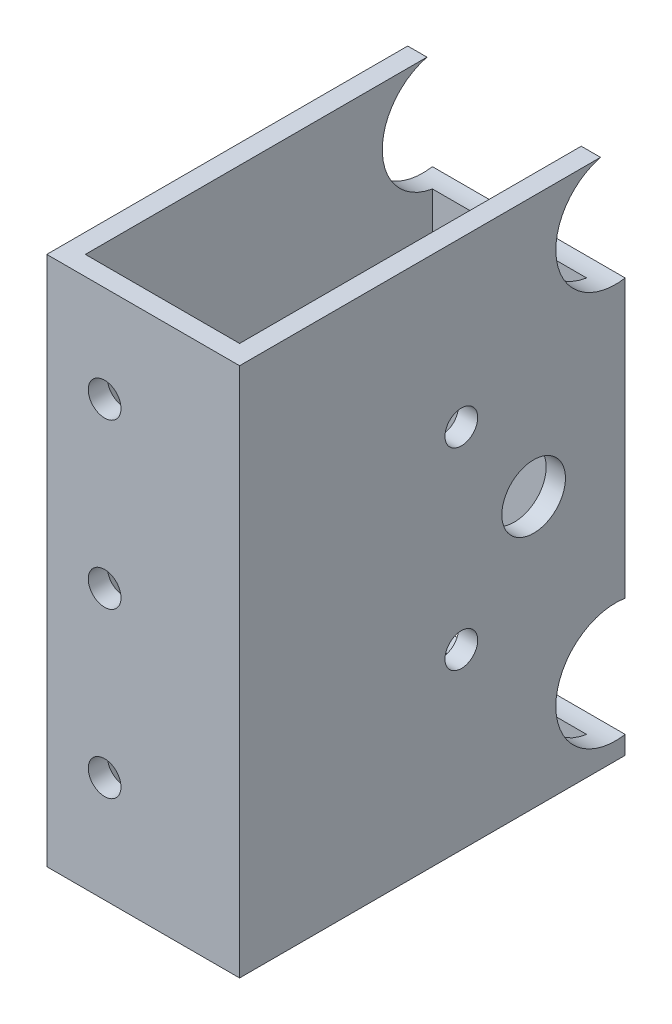
ISO-10303-21;
HEADER;
FILE_DESCRIPTION(('STEP AP214'),'2;1');
FILE_NAME('part.step','',(''),(''),'','','');
FILE_SCHEMA(('AUTOMOTIVE_DESIGN { 1 0 10303 214 1 1 1 1 }'));
ENDSEC;
DATA;
#1=APPLICATION_CONTEXT('core data for automotive mechanical design processes');
#2=APPLICATION_PROTOCOL_DEFINITION('international standard','automotive_design',2000,#1);
#3=PRODUCT_CONTEXT('',#1,'mechanical');
#4=PRODUCT('Part','Part','',(#3));
#5=PRODUCT_RELATED_PRODUCT_CATEGORY('part','',(#4));
#6=PRODUCT_DEFINITION_FORMATION('','',#4);
#7=PRODUCT_DEFINITION_CONTEXT('part definition',#1,'design');
#8=PRODUCT_DEFINITION('design','',#6,#7);
#9=PRODUCT_DEFINITION_SHAPE('','',#8);
#10=(LENGTH_UNIT() NAMED_UNIT(*) SI_UNIT(.MILLI.,.METRE.));
#11=(NAMED_UNIT(*) PLANE_ANGLE_UNIT() SI_UNIT($,.RADIAN.));
#12=(NAMED_UNIT(*) SI_UNIT($,.STERADIAN.) SOLID_ANGLE_UNIT());
#13=UNCERTAINTY_MEASURE_WITH_UNIT(LENGTH_MEASURE(1.E-05),#10,'distance_accuracy_value','');
#14=(GEOMETRIC_REPRESENTATION_CONTEXT(3) GLOBAL_UNCERTAINTY_ASSIGNED_CONTEXT((#13)) GLOBAL_UNIT_ASSIGNED_CONTEXT((#10,
#11,#12)) REPRESENTATION_CONTEXT('',''));
#15=CARTESIAN_POINT('',(0.,0.,0.));
#16=DIRECTION('',(0.,0.,1.));
#17=DIRECTION('',(1.,0.,0.));
#18=AXIS2_PLACEMENT_3D('',#15,#16,#17);
#19=CARTESIAN_POINT('',(0.,0.,-29.));
#20=DIRECTION('',(0.,0.,1.));
#21=DIRECTION('',(1.,0.,0.));
#22=AXIS2_PLACEMENT_3D('',#19,#20,#21);
#23=PLANE('',#22);
#24=DIRECTION('',(-1.,0.,0.));
#25=VECTOR('',#24,1.);
#26=CARTESIAN_POINT('',(49.9,43.8811765836887,-29.));
#27=LINE('',#26,#25);
#28=CARTESIAN_POINT('',(29.708348754,43.8811765836887,-29.));
#29=VERTEX_POINT('',#28);
#30=CARTESIAN_POINT('',(49.708348754,43.8811765836887,-29.));
#31=VERTEX_POINT('',#30);
#32=EDGE_CURVE('E279',#29,#31,#27,.F.);
#33=ORIENTED_EDGE('',*,*,#32,.T.);
#34=DIRECTION('',(0.,-1.,0.));
#35=VECTOR('',#34,1.);
#36=CARTESIAN_POINT('',(49.708348754,56.,-29.));
#37=LINE('',#36,#35);
#38=CARTESIAN_POINT('',(49.708348754,15.1188234163113,-29.));
#39=VERTEX_POINT('',#38);
#40=EDGE_CURVE('E198',#31,#39,#37,.T.);
#41=ORIENTED_EDGE('',*,*,#40,.T.);
#42=DIRECTION('',(-1.,0.,0.));
#43=VECTOR('',#42,1.);
#44=CARTESIAN_POINT('',(49.9,15.1188234163113,-29.));
#45=LINE('',#44,#43);
#46=CARTESIAN_POINT('',(29.708348754,15.1188234163113,-29.));
#47=VERTEX_POINT('',#46);
#48=EDGE_CURVE('E283',#39,#47,#45,.T.);
#49=ORIENTED_EDGE('',*,*,#48,.T.);
#50=DIRECTION('',(0.,1.,0.));
#51=VECTOR('',#50,1.);
#52=CARTESIAN_POINT('',(29.708348754,1.,-29.));
#53=LINE('',#52,#51);
#54=EDGE_CURVE('E181',#47,#29,#53,.T.);
#55=ORIENTED_EDGE('',*,*,#54,.T.);
#56=EDGE_LOOP('',(#33,#41,#49,#55));
#57=FACE_BOUND('',#56,.T.);
#58=ADVANCED_FACE('F41',(#57),#23,.F.);
#59=CARTESIAN_POINT('',(0.,0.,-27.));
#60=DIRECTION('',(0.,0.,1.));
#61=DIRECTION('',(1.,0.,0.));
#62=AXIS2_PLACEMENT_3D('',#59,#60,#61);
#63=PLANE('',#62);
#64=DIRECTION('',(0.,1.,0.));
#65=VECTOR('',#64,1.);
#66=CARTESIAN_POINT('',(31.708348754,0.899999999999999,-27.));
#67=LINE('',#66,#65);
#68=CARTESIAN_POINT('',(31.708348754,15.1188234163113,-27.));
#69=VERTEX_POINT('',#68);
#70=CARTESIAN_POINT('',(31.708348754,43.8811765836887,-27.));
#71=VERTEX_POINT('',#70);
#72=EDGE_CURVE('E293',#69,#71,#67,.T.);
#73=ORIENTED_EDGE('',*,*,#72,.F.);
#74=DIRECTION('',(-1.,0.,0.));
#75=VECTOR('',#74,1.);
#76=CARTESIAN_POINT('',(49.9,15.1188234163113,-27.));
#77=LINE('',#76,#75);
#78=CARTESIAN_POINT('',(47.708348754,15.1188234163113,-27.));
#79=VERTEX_POINT('',#78);
#80=EDGE_CURVE('E161',#79,#69,#77,.T.);
#81=ORIENTED_EDGE('',*,*,#80,.F.);
#82=DIRECTION('',(0.,-1.,0.));
#83=VECTOR('',#82,1.);
#84=CARTESIAN_POINT('',(47.708348754,56.1,-27.));
#85=LINE('',#84,#83);
#86=CARTESIAN_POINT('',(47.708348754,43.8811765836887,-27.));
#87=VERTEX_POINT('',#86);
#88=EDGE_CURVE('E143',#87,#79,#85,.T.);
#89=ORIENTED_EDGE('',*,*,#88,.F.);
#90=DIRECTION('',(-1.,0.,0.));
#91=VECTOR('',#90,1.);
#92=CARTESIAN_POINT('',(49.9,43.8811765836887,-27.));
#93=LINE('',#92,#91);
#94=EDGE_CURVE('E151',#71,#87,#93,.F.);
#95=ORIENTED_EDGE('',*,*,#94,.F.);
#96=EDGE_LOOP('',(#73,#81,#89,#95));
#97=FACE_BOUND('',#96,.T.);
#98=ADVANCED_FACE('F163',(#97),#63,.T.);
#99=CARTESIAN_POINT('',(29.708348754,56.,11.));
#100=DIRECTION('',(0.,-1.,0.));
#101=DIRECTION('',(0.,0.,1.));
#102=AXIS2_PLACEMENT_3D('',#99,#100,#101);
#103=PLANE('',#102);
#104=DIRECTION('',(-1.,0.,0.));
#105=VECTOR('',#104,1.);
#106=CARTESIAN_POINT('',(49.9,56.,-26.4379500648187));
#107=LINE('',#106,#105);
#108=CARTESIAN_POINT('',(49.708348754,56.,-26.4379500648187));
#109=VERTEX_POINT('',#108);
#110=CARTESIAN_POINT('',(47.708348754,56.,-26.4379500648187));
#111=VERTEX_POINT('',#110);
#112=EDGE_CURVE('E156',#109,#111,#107,.T.);
#113=ORIENTED_EDGE('',*,*,#112,.T.);
#114=DIRECTION('',(0.,0.,1.));
#115=VECTOR('',#114,1.);
#116=CARTESIAN_POINT('',(47.708348754,56.,11.));
#117=LINE('',#116,#115);
#118=CARTESIAN_POINT('',(47.708348754,56.,9.00000000000001));
#119=VERTEX_POINT('',#118);
#120=EDGE_CURVE('E150',#111,#119,#117,.T.);
#121=ORIENTED_EDGE('',*,*,#120,.T.);
#122=DIRECTION('',(1.,0.,0.));
#123=VECTOR('',#122,1.);
#124=CARTESIAN_POINT('',(29.708348754,56.,9.00000000000001));
#125=LINE('',#124,#123);
#126=CARTESIAN_POINT('',(31.708348754,56.,9.00000000000001));
#127=VERTEX_POINT('',#126);
#128=EDGE_CURVE('E172',#127,#119,#125,.T.);
#129=ORIENTED_EDGE('',*,*,#128,.F.);
#130=DIRECTION('',(0.,0.,-1.));
#131=VECTOR('',#130,1.);
#132=CARTESIAN_POINT('',(31.708348754,56.,11.));
#133=LINE('',#132,#131);
#134=CARTESIAN_POINT('',(31.708348754,56.,-26.4379500648187));
#135=VERTEX_POINT('',#134);
#136=EDGE_CURVE('E178',#127,#135,#133,.T.);
#137=ORIENTED_EDGE('',*,*,#136,.T.);
#138=CARTESIAN_POINT('',(29.708348754,56.,-26.4379500648187));
#139=VERTEX_POINT('',#138);
#140=EDGE_CURVE('E266',#135,#139,#107,.T.);
#141=ORIENTED_EDGE('',*,*,#140,.T.);
#142=DIRECTION('',(0.,0.,-1.));
#143=VECTOR('',#142,1.);
#144=CARTESIAN_POINT('',(29.708348754,56.,11.));
#145=LINE('',#144,#143);
#146=CARTESIAN_POINT('',(29.708348754,56.,11.));
#147=VERTEX_POINT('',#146);
#148=EDGE_CURVE('E209',#147,#139,#145,.T.);
#149=ORIENTED_EDGE('',*,*,#148,.F.);
#150=DIRECTION('',(1.,0.,0.));
#151=VECTOR('',#150,1.);
#152=CARTESIAN_POINT('',(29.708348754,56.,11.));
#153=LINE('',#152,#151);
#154=CARTESIAN_POINT('',(49.708348754,56.,11.));
#155=VERTEX_POINT('',#154);
#156=EDGE_CURVE('E183',#147,#155,#153,.T.);
#157=ORIENTED_EDGE('',*,*,#156,.T.);
#158=DIRECTION('',(0.,0.,-1.));
#159=VECTOR('',#158,1.);
#160=CARTESIAN_POINT('',(49.708348754,56.,11.));
#161=LINE('',#160,#159);
#162=EDGE_CURVE('E207',#155,#109,#161,.T.);
#163=ORIENTED_EDGE('',*,*,#162,.T.);
#164=EDGE_LOOP('',(#113,#121,#129,#137,#141,#149,#157,#163));
#165=FACE_BOUND('',#164,.T.);
#166=ADVANCED_FACE('F327',(#165),#103,.F.);
#167=DIRECTION('',(-1.,0.,0.));
#168=VECTOR('',#167,1.);
#169=CARTESIAN_POINT('',(49.9,2.88117658368866,-29.));
#170=LINE('',#169,#168);
#171=CARTESIAN_POINT('',(29.708348754,2.88117658368866,-29.));
#172=VERTEX_POINT('',#171);
#173=CARTESIAN_POINT('',(49.708348754,2.88117658368866,-29.));
#174=VERTEX_POINT('',#173);
#175=EDGE_CURVE('E286',#172,#174,#170,.F.);
#176=ORIENTED_EDGE('',*,*,#175,.T.);
#177=CARTESIAN_POINT('',(49.708348754,1.,-29.));
#178=VERTEX_POINT('',#177);
#179=EDGE_CURVE('E200',#174,#178,#37,.T.);
#180=ORIENTED_EDGE('',*,*,#179,.T.);
#181=DIRECTION('',(-1.,0.,0.));
#182=VECTOR('',#181,1.);
#183=CARTESIAN_POINT('',(49.708348754,1.,-29.));
#184=LINE('',#183,#182);
#185=CARTESIAN_POINT('',(29.708348754,1.,-29.));
#186=VERTEX_POINT('',#185);
#187=EDGE_CURVE('E184',#178,#186,#184,.T.);
#188=ORIENTED_EDGE('',*,*,#187,.T.);
#189=EDGE_CURVE('E193',#186,#172,#53,.T.);
#190=ORIENTED_EDGE('',*,*,#189,.T.);
#191=EDGE_LOOP('',(#176,#180,#188,#190));
#192=FACE_BOUND('',#191,.T.);
#193=ADVANCED_FACE('F316',(#192),#23,.F.);
#194=CARTESIAN_POINT('',(31.708348754,1.,-27.));
#195=VERTEX_POINT('',#194);
#196=CARTESIAN_POINT('',(31.708348754,2.88117658368866,-27.));
#197=VERTEX_POINT('',#196);
#198=EDGE_CURVE('E167',#195,#197,#67,.T.);
#199=ORIENTED_EDGE('',*,*,#198,.F.);
#200=DIRECTION('',(-1.,0.,0.));
#201=VECTOR('',#200,1.);
#202=CARTESIAN_POINT('',(49.708348754,1.,-27.));
#203=LINE('',#202,#201);
#204=CARTESIAN_POINT('',(47.708348754,1.,-27.));
#205=VERTEX_POINT('',#204);
#206=EDGE_CURVE('E211',#205,#195,#203,.T.);
#207=ORIENTED_EDGE('',*,*,#206,.F.);
#208=CARTESIAN_POINT('',(47.708348754,2.88117658368866,-27.));
#209=VERTEX_POINT('',#208);
#210=EDGE_CURVE('E164',#209,#205,#85,.T.);
#211=ORIENTED_EDGE('',*,*,#210,.F.);
#212=DIRECTION('',(-1.,0.,0.));
#213=VECTOR('',#212,1.);
#214=CARTESIAN_POINT('',(49.9,2.88117658368866,-27.));
#215=LINE('',#214,#213);
#216=EDGE_CURVE('E49',#197,#209,#215,.F.);
#217=ORIENTED_EDGE('',*,*,#216,.F.);
#218=EDGE_LOOP('',(#199,#207,#211,#217));
#219=FACE_BOUND('',#218,.T.);
#220=ADVANCED_FACE('F304',(#219),#63,.T.);
#221=CARTESIAN_POINT('',(29.708348754,1.,11.));
#222=DIRECTION('',(1.,0.,0.));
#223=DIRECTION('',(0.,0.,-1.));
#224=AXIS2_PLACEMENT_3D('',#221,#222,#223);
#225=PLANE('',#224);
#226=CARTESIAN_POINT('',(29.708348754,29.,-19.5));
#227=DIRECTION('',(-1.,0.,0.));
#228=DIRECTION('',(0.,0.,-1.));
#229=AXIS2_PLACEMENT_3D('',#226,#227,#228);
#230=CIRCLE('',#229,3.3);
#231=CARTESIAN_POINT('',(29.708348754,29.,-22.8));
#232=VERTEX_POINT('',#231);
#233=EDGE_CURVE('E267',#232,#232,#230,.F.);
#234=ORIENTED_EDGE('',*,*,#233,.T.);
#235=EDGE_LOOP('',(#234));
#236=FACE_BOUND('',#235,.T.);
#237=CARTESIAN_POINT('',(29.708348754,50.,-28.));
#238=DIRECTION('',(-1.,0.,0.));
#239=DIRECTION('',(0.,0.,-1.));
#240=AXIS2_PLACEMENT_3D('',#237,#238,#239);
#241=CIRCLE('',#240,6.2);
#242=EDGE_CURVE('E274',#139,#29,#241,.F.);
#243=ORIENTED_EDGE('',*,*,#242,.T.);
#244=ORIENTED_EDGE('',*,*,#54,.F.);
#245=CARTESIAN_POINT('',(29.708348754,9.,-28.));
#246=DIRECTION('',(-1.,0.,0.));
#247=DIRECTION('',(0.,0.,-1.));
#248=AXIS2_PLACEMENT_3D('',#245,#246,#247);
#249=CIRCLE('',#248,6.2);
#250=EDGE_CURVE('E290',#47,#172,#249,.F.);
#251=ORIENTED_EDGE('',*,*,#250,.T.);
#252=ORIENTED_EDGE('',*,*,#189,.F.);
#253=DIRECTION('',(0.,0.,-1.));
#254=VECTOR('',#253,1.);
#255=CARTESIAN_POINT('',(29.708348754,1.,11.));
#256=LINE('',#255,#254);
#257=CARTESIAN_POINT('',(29.708348754,1.,11.));
#258=VERTEX_POINT('',#257);
#259=EDGE_CURVE('E195',#258,#186,#256,.T.);
#260=ORIENTED_EDGE('',*,*,#259,.F.);
#261=DIRECTION('',(0.,1.,0.));
#262=VECTOR('',#261,1.);
#263=CARTESIAN_POINT('',(29.708348754,1.,11.));
#264=LINE('',#263,#262);
#265=EDGE_CURVE('E185',#258,#147,#264,.T.);
#266=ORIENTED_EDGE('',*,*,#265,.T.);
#267=ORIENTED_EDGE('',*,*,#148,.T.);
#268=EDGE_LOOP('',(#243,#244,#251,#252,#260,#266,#267));
#269=FACE_BOUND('',#268,.T.);
#270=ADVANCED_FACE('F43',(#236,#269),#225,.F.);
#271=CARTESIAN_POINT('',(49.708348754,56.,11.));
#272=DIRECTION('',(-1.,0.,0.));
#273=DIRECTION('',(0.,0.,1.));
#274=AXIS2_PLACEMENT_3D('',#271,#272,#273);
#275=PLANE('',#274);
#276=CARTESIAN_POINT('',(49.708348754,39.,-12.));
#277=DIRECTION('',(1.,0.,0.));
#278=DIRECTION('',(0.,0.,1.));
#279=AXIS2_PLACEMENT_3D('',#276,#277,#278);
#280=CIRCLE('',#279,1.7);
#281=CARTESIAN_POINT('',(49.708348754,39.,-10.3));
#282=VERTEX_POINT('',#281);
#283=EDGE_CURVE('E242',#282,#282,#280,.F.);
#284=ORIENTED_EDGE('',*,*,#283,.T.);
#285=EDGE_LOOP('',(#284));
#286=FACE_BOUND('',#285,.T.);
#287=CARTESIAN_POINT('',(49.708348754,19.,-12.));
#288=DIRECTION('',(1.,0.,0.));
#289=DIRECTION('',(0.,0.,1.));
#290=AXIS2_PLACEMENT_3D('',#287,#288,#289);
#291=CIRCLE('',#290,1.7);
#292=CARTESIAN_POINT('',(49.708348754,19.,-10.3));
#293=VERTEX_POINT('',#292);
#294=EDGE_CURVE('E241',#293,#293,#291,.F.);
#295=ORIENTED_EDGE('',*,*,#294,.T.);
#296=EDGE_LOOP('',(#295));
#297=FACE_BOUND('',#296,.T.);
#298=CARTESIAN_POINT('',(49.708348754,29.,-19.5));
#299=DIRECTION('',(1.,0.,0.));
#300=DIRECTION('',(0.,0.,1.));
#301=AXIS2_PLACEMENT_3D('',#298,#299,#300);
#302=CIRCLE('',#301,3.3);
#303=CARTESIAN_POINT('',(49.708348754,29.,-16.2));
#304=VERTEX_POINT('',#303);
#305=EDGE_CURVE('E263',#304,#304,#302,.F.);
#306=ORIENTED_EDGE('',*,*,#305,.T.);
#307=EDGE_LOOP('',(#306));
#308=FACE_BOUND('',#307,.T.);
#309=CARTESIAN_POINT('',(49.708348754,50.,-28.));
#310=DIRECTION('',(1.,0.,0.));
#311=DIRECTION('',(0.,0.,1.));
#312=AXIS2_PLACEMENT_3D('',#309,#310,#311);
#313=CIRCLE('',#312,6.2);
#314=EDGE_CURVE('E275',#31,#109,#313,.F.);
#315=ORIENTED_EDGE('',*,*,#314,.T.);
#316=ORIENTED_EDGE('',*,*,#162,.F.);
#317=DIRECTION('',(0.,-1.,0.));
#318=VECTOR('',#317,1.);
#319=CARTESIAN_POINT('',(49.708348754,56.,11.));
#320=LINE('',#319,#318);
#321=CARTESIAN_POINT('',(49.708348754,1.,11.));
#322=VERTEX_POINT('',#321);
#323=EDGE_CURVE('E189',#155,#322,#320,.T.);
#324=ORIENTED_EDGE('',*,*,#323,.T.);
#325=DIRECTION('',(0.,0.,-1.));
#326=VECTOR('',#325,1.);
#327=CARTESIAN_POINT('',(49.708348754,1.,11.));
#328=LINE('',#327,#326);
#329=EDGE_CURVE('E201',#322,#178,#328,.T.);
#330=ORIENTED_EDGE('',*,*,#329,.T.);
#331=ORIENTED_EDGE('',*,*,#179,.F.);
#332=CARTESIAN_POINT('',(49.708348754,9.,-28.));
#333=DIRECTION('',(1.,0.,0.));
#334=DIRECTION('',(0.,0.,1.));
#335=AXIS2_PLACEMENT_3D('',#332,#333,#334);
#336=CIRCLE('',#335,6.2);
#337=EDGE_CURVE('E63',#174,#39,#336,.F.);
#338=ORIENTED_EDGE('',*,*,#337,.T.);
#339=ORIENTED_EDGE('',*,*,#40,.F.);
#340=EDGE_LOOP('',(#315,#316,#324,#330,#331,#338,#339));
#341=FACE_BOUND('',#340,.T.);
#342=ADVANCED_FACE('F326',(#286,#297,#308,#341),#275,.F.);
#343=CARTESIAN_POINT('',(49.708348754,1.,11.));
#344=DIRECTION('',(0.,1.,0.));
#345=DIRECTION('',(0.,0.,-1.));
#346=AXIS2_PLACEMENT_3D('',#343,#344,#345);
#347=PLANE('',#346);
#348=DIRECTION('',(0.,0.,-1.));
#349=VECTOR('',#348,1.);
#350=CARTESIAN_POINT('',(47.708348754,1.,11.));
#351=LINE('',#350,#349);
#352=CARTESIAN_POINT('',(47.708348754,1.00000000000001,9.00000000000001));
#353=VERTEX_POINT('',#352);
#354=EDGE_CURVE('E212',#353,#205,#351,.T.);
#355=ORIENTED_EDGE('',*,*,#354,.T.);
#356=ORIENTED_EDGE('',*,*,#206,.T.);
#357=DIRECTION('',(0.,0.,1.));
#358=VECTOR('',#357,1.);
#359=CARTESIAN_POINT('',(31.708348754,1.,11.));
#360=LINE('',#359,#358);
#361=CARTESIAN_POINT('',(31.708348754,1.,9.00000000000001));
#362=VERTEX_POINT('',#361);
#363=EDGE_CURVE('E220',#195,#362,#360,.T.);
#364=ORIENTED_EDGE('',*,*,#363,.T.);
#365=DIRECTION('',(-1.,0.,0.));
#366=VECTOR('',#365,1.);
#367=CARTESIAN_POINT('',(49.708348754,1.,9.00000000000001));
#368=LINE('',#367,#366);
#369=EDGE_CURVE('E219',#353,#362,#368,.T.);
#370=ORIENTED_EDGE('',*,*,#369,.F.);
#371=EDGE_LOOP('',(#355,#356,#364,#370));
#372=FACE_BOUND('',#371,.T.);
#373=ORIENTED_EDGE('',*,*,#187,.F.);
#374=ORIENTED_EDGE('',*,*,#329,.F.);
#375=DIRECTION('',(-1.,0.,0.));
#376=VECTOR('',#375,1.);
#377=CARTESIAN_POINT('',(49.708348754,1.,11.));
#378=LINE('',#377,#376);
#379=EDGE_CURVE('E194',#322,#258,#378,.T.);
#380=ORIENTED_EDGE('',*,*,#379,.T.);
#381=ORIENTED_EDGE('',*,*,#259,.T.);
#382=EDGE_LOOP('',(#373,#374,#380,#381));
#383=FACE_BOUND('',#382,.T.);
#384=ADVANCED_FACE('F296',(#372,#383),#347,.F.);
#385=CARTESIAN_POINT('',(0.,0.,11.));
#386=DIRECTION('',(0.,0.,1.));
#387=DIRECTION('',(1.,0.,0.));
#388=AXIS2_PLACEMENT_3D('',#385,#386,#387);
#389=PLANE('',#388);
#390=CARTESIAN_POINT('',(35.708348754,46.,11.));
#391=DIRECTION('',(0.,0.,-1.));
#392=DIRECTION('',(1.,0.,0.));
#393=AXIS2_PLACEMENT_3D('',#390,#391,#392);
#394=CIRCLE('',#393,1.7);
#395=CARTESIAN_POINT('',(37.408348754,46.,11.));
#396=VERTEX_POINT('',#395);
#397=EDGE_CURVE('E238',#396,#396,#394,.F.);
#398=ORIENTED_EDGE('',*,*,#397,.F.);
#399=EDGE_LOOP('',(#398));
#400=FACE_BOUND('',#399,.T.);
#401=CARTESIAN_POINT('',(35.708348754,29.,11.));
#402=DIRECTION('',(0.,0.,-1.));
#403=DIRECTION('',(1.,0.,0.));
#404=AXIS2_PLACEMENT_3D('',#401,#402,#403);
#405=CIRCLE('',#404,1.7);
#406=CARTESIAN_POINT('',(37.408348754,29.,11.));
#407=VERTEX_POINT('',#406);
#408=EDGE_CURVE('E234',#407,#407,#405,.F.);
#409=ORIENTED_EDGE('',*,*,#408,.F.);
#410=EDGE_LOOP('',(#409));
#411=FACE_BOUND('',#410,.T.);
#412=CARTESIAN_POINT('',(35.708348754,12.,11.));
#413=DIRECTION('',(0.,0.,-1.));
#414=DIRECTION('',(1.,0.,0.));
#415=AXIS2_PLACEMENT_3D('',#412,#413,#414);
#416=CIRCLE('',#415,1.7);
#417=CARTESIAN_POINT('',(37.408348754,12.,11.));
#418=VERTEX_POINT('',#417);
#419=EDGE_CURVE('E229',#418,#418,#416,.F.);
#420=ORIENTED_EDGE('',*,*,#419,.F.);
#421=EDGE_LOOP('',(#420));
#422=FACE_BOUND('',#421,.T.);
#423=ORIENTED_EDGE('',*,*,#265,.F.);
#424=ORIENTED_EDGE('',*,*,#379,.F.);
#425=ORIENTED_EDGE('',*,*,#323,.F.);
#426=ORIENTED_EDGE('',*,*,#156,.F.);
#427=EDGE_LOOP('',(#423,#424,#425,#426));
#428=FACE_BOUND('',#427,.T.);
#429=ADVANCED_FACE('F333',(#400,#411,#422,#428),#389,.T.);
#430=CARTESIAN_POINT('',(31.708348754,0.899999999999999,9.00000000000001));
#431=DIRECTION('',(1.,0.,0.));
#432=DIRECTION('',(0.,0.,-1.));
#433=AXIS2_PLACEMENT_3D('',#430,#431,#432);
#434=PLANE('',#433);
#435=CARTESIAN_POINT('',(31.708348754,29.,-19.5));
#436=DIRECTION('',(-1.,0.,0.));
#437=DIRECTION('',(0.,0.,-1.));
#438=AXIS2_PLACEMENT_3D('',#435,#436,#437);
#439=CIRCLE('',#438,3.3);
#440=CARTESIAN_POINT('',(31.708348754,29.,-22.8));
#441=VERTEX_POINT('',#440);
#442=EDGE_CURVE('E230',#441,#441,#439,.F.);
#443=ORIENTED_EDGE('',*,*,#442,.F.);
#444=EDGE_LOOP('',(#443));
#445=FACE_BOUND('',#444,.T.);
#446=ORIENTED_EDGE('',*,*,#136,.F.);
#447=DIRECTION('',(0.,1.,0.));
#448=VECTOR('',#447,1.);
#449=CARTESIAN_POINT('',(31.708348754,0.899999999999999,9.00000000000001));
#450=LINE('',#449,#448);
#451=EDGE_CURVE('E165',#362,#127,#450,.T.);
#452=ORIENTED_EDGE('',*,*,#451,.F.);
#453=ORIENTED_EDGE('',*,*,#363,.F.);
#454=ORIENTED_EDGE('',*,*,#198,.T.);
#455=CARTESIAN_POINT('',(31.708348754,9.,-28.));
#456=DIRECTION('',(-1.,0.,0.));
#457=DIRECTION('',(0.,0.,-1.));
#458=AXIS2_PLACEMENT_3D('',#455,#456,#457);
#459=CIRCLE('',#458,6.2);
#460=EDGE_CURVE('E281',#69,#197,#459,.F.);
#461=ORIENTED_EDGE('',*,*,#460,.F.);
#462=ORIENTED_EDGE('',*,*,#72,.T.);
#463=CARTESIAN_POINT('',(31.708348754,50.,-28.));
#464=DIRECTION('',(-1.,0.,0.));
#465=DIRECTION('',(0.,0.,-1.));
#466=AXIS2_PLACEMENT_3D('',#463,#464,#465);
#467=CIRCLE('',#466,6.2);
#468=EDGE_CURVE('E154',#135,#71,#467,.F.);
#469=ORIENTED_EDGE('',*,*,#468,.F.);
#470=EDGE_LOOP('',(#446,#452,#453,#454,#461,#462,#469));
#471=FACE_BOUND('',#470,.T.);
#472=ADVANCED_FACE('F307',(#445,#471),#434,.T.);
#473=CARTESIAN_POINT('',(47.708348754,56.1,9.00000000000001));
#474=DIRECTION('',(-1.,0.,0.));
#475=DIRECTION('',(0.,0.,1.));
#476=AXIS2_PLACEMENT_3D('',#473,#474,#475);
#477=PLANE('',#476);
#478=CARTESIAN_POINT('',(47.708348754,39.,-12.));
#479=DIRECTION('',(1.,0.,0.));
#480=DIRECTION('',(0.,0.,1.));
#481=AXIS2_PLACEMENT_3D('',#478,#479,#480);
#482=CIRCLE('',#481,1.7);
#483=CARTESIAN_POINT('',(47.708348754,39.,-10.3));
#484=VERTEX_POINT('',#483);
#485=EDGE_CURVE('E44',#484,#484,#482,.F.);
#486=ORIENTED_EDGE('',*,*,#485,.F.);
#487=EDGE_LOOP('',(#486));
#488=FACE_BOUND('',#487,.T.);
#489=CARTESIAN_POINT('',(47.708348754,19.,-12.));
#490=DIRECTION('',(1.,0.,0.));
#491=DIRECTION('',(0.,0.,1.));
#492=AXIS2_PLACEMENT_3D('',#489,#490,#491);
#493=CIRCLE('',#492,1.7);
#494=CARTESIAN_POINT('',(47.708348754,19.,-10.3));
#495=VERTEX_POINT('',#494);
#496=EDGE_CURVE('E245',#495,#495,#493,.F.);
#497=ORIENTED_EDGE('',*,*,#496,.F.);
#498=EDGE_LOOP('',(#497));
#499=FACE_BOUND('',#498,.T.);
#500=CARTESIAN_POINT('',(47.708348754,29.,-19.5));
#501=DIRECTION('',(1.,0.,0.));
#502=DIRECTION('',(0.,0.,1.));
#503=AXIS2_PLACEMENT_3D('',#500,#501,#502);
#504=CIRCLE('',#503,3.3);
#505=CARTESIAN_POINT('',(47.708348754,29.,-16.2));
#506=VERTEX_POINT('',#505);
#507=EDGE_CURVE('E228',#506,#506,#504,.F.);
#508=ORIENTED_EDGE('',*,*,#507,.F.);
#509=EDGE_LOOP('',(#508));
#510=FACE_BOUND('',#509,.T.);
#511=ORIENTED_EDGE('',*,*,#88,.T.);
#512=CARTESIAN_POINT('',(47.708348754,9.,-28.));
#513=DIRECTION('',(1.,0.,0.));
#514=DIRECTION('',(0.,0.,1.));
#515=AXIS2_PLACEMENT_3D('',#512,#513,#514);
#516=CIRCLE('',#515,6.2);
#517=EDGE_CURVE('E278',#209,#79,#516,.F.);
#518=ORIENTED_EDGE('',*,*,#517,.F.);
#519=ORIENTED_EDGE('',*,*,#210,.T.);
#520=ORIENTED_EDGE('',*,*,#354,.F.);
#521=DIRECTION('',(0.,-1.,0.));
#522=VECTOR('',#521,1.);
#523=CARTESIAN_POINT('',(47.708348754,56.1,9.00000000000001));
#524=LINE('',#523,#522);
#525=EDGE_CURVE('E170',#119,#353,#524,.T.);
#526=ORIENTED_EDGE('',*,*,#525,.F.);
#527=ORIENTED_EDGE('',*,*,#120,.F.);
#528=CARTESIAN_POINT('',(47.708348754,50.,-28.));
#529=DIRECTION('',(1.,0.,0.));
#530=DIRECTION('',(0.,0.,1.));
#531=AXIS2_PLACEMENT_3D('',#528,#529,#530);
#532=CIRCLE('',#531,6.2);
#533=EDGE_CURVE('E11',#87,#111,#532,.F.);
#534=ORIENTED_EDGE('',*,*,#533,.F.);
#535=EDGE_LOOP('',(#511,#518,#519,#520,#526,#527,#534));
#536=FACE_BOUND('',#535,.T.);
#537=ADVANCED_FACE('F141',(#488,#499,#510,#536),#477,.T.);
#538=CARTESIAN_POINT('',(0.,0.,9.00000000000001));
#539=DIRECTION('',(0.,0.,1.));
#540=DIRECTION('',(1.,0.,0.));
#541=AXIS2_PLACEMENT_3D('',#538,#539,#540);
#542=PLANE('',#541);
#543=CARTESIAN_POINT('',(35.708348754,46.,9.00000000000001));
#544=DIRECTION('',(0.,0.,-1.));
#545=DIRECTION('',(1.,0.,0.));
#546=AXIS2_PLACEMENT_3D('',#543,#544,#545);
#547=CIRCLE('',#546,1.7);
#548=CARTESIAN_POINT('',(37.408348754,46.,9.00000000000001));
#549=VERTEX_POINT('',#548);
#550=EDGE_CURVE('E237',#549,#549,#547,.F.);
#551=ORIENTED_EDGE('',*,*,#550,.T.);
#552=EDGE_LOOP('',(#551));
#553=FACE_BOUND('',#552,.T.);
#554=CARTESIAN_POINT('',(35.708348754,29.,9.00000000000001));
#555=DIRECTION('',(0.,0.,-1.));
#556=DIRECTION('',(1.,0.,0.));
#557=AXIS2_PLACEMENT_3D('',#554,#555,#556);
#558=CIRCLE('',#557,1.7);
#559=CARTESIAN_POINT('',(37.408348754,29.,9.00000000000001));
#560=VERTEX_POINT('',#559);
#561=EDGE_CURVE('E232',#560,#560,#558,.F.);
#562=ORIENTED_EDGE('',*,*,#561,.T.);
#563=EDGE_LOOP('',(#562));
#564=FACE_BOUND('',#563,.T.);
#565=CARTESIAN_POINT('',(35.708348754,12.,9.00000000000001));
#566=DIRECTION('',(0.,0.,-1.));
#567=DIRECTION('',(1.,0.,0.));
#568=AXIS2_PLACEMENT_3D('',#565,#566,#567);
#569=CIRCLE('',#568,1.7);
#570=CARTESIAN_POINT('',(37.408348754,12.,9.00000000000001));
#571=VERTEX_POINT('',#570);
#572=EDGE_CURVE('E233',#571,#571,#569,.F.);
#573=ORIENTED_EDGE('',*,*,#572,.T.);
#574=EDGE_LOOP('',(#573));
#575=FACE_BOUND('',#574,.T.);
#576=ORIENTED_EDGE('',*,*,#451,.T.);
#577=ORIENTED_EDGE('',*,*,#128,.T.);
#578=ORIENTED_EDGE('',*,*,#525,.T.);
#579=ORIENTED_EDGE('',*,*,#369,.T.);
#580=EDGE_LOOP('',(#576,#577,#578,#579));
#581=FACE_BOUND('',#580,.T.);
#582=ADVANCED_FACE('F295',(#553,#564,#575,#581),#542,.F.);
#583=CARTESIAN_POINT('',(49.9,9.,-28.));
#584=DIRECTION('',(-1.,0.,0.));
#585=DIRECTION('',(0.,0.,1.));
#586=AXIS2_PLACEMENT_3D('',#583,#584,#585);
#587=CYLINDRICAL_SURFACE('',#586,6.2);
#588=ORIENTED_EDGE('',*,*,#460,.T.);
#589=ORIENTED_EDGE('',*,*,#216,.T.);
#590=ORIENTED_EDGE('',*,*,#517,.T.);
#591=ORIENTED_EDGE('',*,*,#80,.T.);
#592=EDGE_LOOP('',(#588,#589,#590,#591));
#593=FACE_BOUND('',#592,.T.);
#594=ORIENTED_EDGE('',*,*,#175,.F.);
#595=ORIENTED_EDGE('',*,*,#250,.F.);
#596=ORIENTED_EDGE('',*,*,#48,.F.);
#597=ORIENTED_EDGE('',*,*,#337,.F.);
#598=EDGE_LOOP('',(#594,#595,#596,#597));
#599=FACE_BOUND('',#598,.T.);
#600=ADVANCED_FACE('F311',(#593,#599),#587,.F.);
#601=CARTESIAN_POINT('',(49.9,50.,-28.));
#602=DIRECTION('',(-1.,0.,0.));
#603=DIRECTION('',(0.,0.,1.));
#604=AXIS2_PLACEMENT_3D('',#601,#602,#603);
#605=CYLINDRICAL_SURFACE('',#604,6.2);
#606=ORIENTED_EDGE('',*,*,#32,.F.);
#607=ORIENTED_EDGE('',*,*,#242,.F.);
#608=ORIENTED_EDGE('',*,*,#140,.F.);
#609=ORIENTED_EDGE('',*,*,#468,.T.);
#610=ORIENTED_EDGE('',*,*,#94,.T.);
#611=ORIENTED_EDGE('',*,*,#533,.T.);
#612=ORIENTED_EDGE('',*,*,#112,.F.);
#613=ORIENTED_EDGE('',*,*,#314,.F.);
#614=EDGE_LOOP('',(#606,#607,#608,#609,#610,#611,#612,#613));
#615=FACE_BOUND('',#614,.T.);
#616=ADVANCED_FACE('F153',(#615),#605,.F.);
#617=CARTESIAN_POINT('',(49.9,29.,-19.5));
#618=DIRECTION('',(-1.,0.,0.));
#619=DIRECTION('',(0.,0.,1.));
#620=AXIS2_PLACEMENT_3D('',#617,#618,#619);
#621=CYLINDRICAL_SURFACE('',#620,3.3);
#622=ORIENTED_EDGE('',*,*,#507,.T.);
#623=EDGE_LOOP('',(#622));
#624=FACE_BOUND('',#623,.T.);
#625=ORIENTED_EDGE('',*,*,#305,.F.);
#626=EDGE_LOOP('',(#625));
#627=FACE_BOUND('',#626,.T.);
#628=ADVANCED_FACE('F391',(#624,#627),#621,.F.);
#629=ORIENTED_EDGE('',*,*,#442,.T.);
#630=EDGE_LOOP('',(#629));
#631=FACE_BOUND('',#630,.T.);
#632=ORIENTED_EDGE('',*,*,#233,.F.);
#633=EDGE_LOOP('',(#632));
#634=FACE_BOUND('',#633,.T.);
#635=ADVANCED_FACE('F402',(#631,#634),#621,.F.);
#636=CARTESIAN_POINT('',(35.708348754,12.,11.1));
#637=DIRECTION('',(0.,0.,-1.));
#638=DIRECTION('',(-1.,0.,0.));
#639=AXIS2_PLACEMENT_3D('',#636,#637,#638);
#640=CYLINDRICAL_SURFACE('',#639,1.7);
#641=ORIENTED_EDGE('',*,*,#419,.T.);
#642=EDGE_LOOP('',(#641));
#643=FACE_BOUND('',#642,.T.);
#644=ORIENTED_EDGE('',*,*,#572,.F.);
#645=EDGE_LOOP('',(#644));
#646=FACE_BOUND('',#645,.T.);
#647=ADVANCED_FACE('F415',(#643,#646),#640,.F.);
#648=CARTESIAN_POINT('',(35.708348754,29.,11.1));
#649=DIRECTION('',(0.,0.,-1.));
#650=DIRECTION('',(-1.,0.,0.));
#651=AXIS2_PLACEMENT_3D('',#648,#649,#650);
#652=CYLINDRICAL_SURFACE('',#651,1.7);
#653=ORIENTED_EDGE('',*,*,#408,.T.);
#654=EDGE_LOOP('',(#653));
#655=FACE_BOUND('',#654,.T.);
#656=ORIENTED_EDGE('',*,*,#561,.F.);
#657=EDGE_LOOP('',(#656));
#658=FACE_BOUND('',#657,.T.);
#659=ADVANCED_FACE('F423',(#655,#658),#652,.F.);
#660=CARTESIAN_POINT('',(35.708348754,46.,11.1));
#661=DIRECTION('',(0.,0.,-1.));
#662=DIRECTION('',(-1.,0.,0.));
#663=AXIS2_PLACEMENT_3D('',#660,#661,#662);
#664=CYLINDRICAL_SURFACE('',#663,1.7);
#665=ORIENTED_EDGE('',*,*,#397,.T.);
#666=EDGE_LOOP('',(#665));
#667=FACE_BOUND('',#666,.T.);
#668=ORIENTED_EDGE('',*,*,#550,.F.);
#669=EDGE_LOOP('',(#668));
#670=FACE_BOUND('',#669,.T.);
#671=ADVANCED_FACE('F431',(#667,#670),#664,.F.);
#672=CARTESIAN_POINT('',(49.9,19.,-12.));
#673=DIRECTION('',(-1.,0.,0.));
#674=DIRECTION('',(0.,0.,1.));
#675=AXIS2_PLACEMENT_3D('',#672,#673,#674);
#676=CYLINDRICAL_SURFACE('',#675,1.7);
#677=ORIENTED_EDGE('',*,*,#496,.T.);
#678=EDGE_LOOP('',(#677));
#679=FACE_BOUND('',#678,.T.);
#680=ORIENTED_EDGE('',*,*,#294,.F.);
#681=EDGE_LOOP('',(#680));
#682=FACE_BOUND('',#681,.T.);
#683=ADVANCED_FACE('F441',(#679,#682),#676,.F.);
#684=CARTESIAN_POINT('',(49.9,39.,-12.));
#685=DIRECTION('',(-1.,0.,0.));
#686=DIRECTION('',(0.,0.,1.));
#687=AXIS2_PLACEMENT_3D('',#684,#685,#686);
#688=CYLINDRICAL_SURFACE('',#687,1.7);
#689=ORIENTED_EDGE('',*,*,#485,.T.);
#690=EDGE_LOOP('',(#689));
#691=FACE_BOUND('',#690,.T.);
#692=ORIENTED_EDGE('',*,*,#283,.F.);
#693=EDGE_LOOP('',(#692));
#694=FACE_BOUND('',#693,.T.);
#695=ADVANCED_FACE('F454',(#691,#694),#688,.F.);
#696=CLOSED_SHELL('',(#58,#98,#166,#193,#220,#270,#342,#384,#429,#472,#537,#582,#600,#616,#628,
#635,#647,#659,#671,#683,#695));
#697=MANIFOLD_SOLID_BREP('B2',#696);
#698=ADVANCED_BREP_SHAPE_REPRESENTATION('',(#18,#697),#14);
#699=SHAPE_DEFINITION_REPRESENTATION(#9,#698);
ENDSEC;
END-ISO-10303-21;
